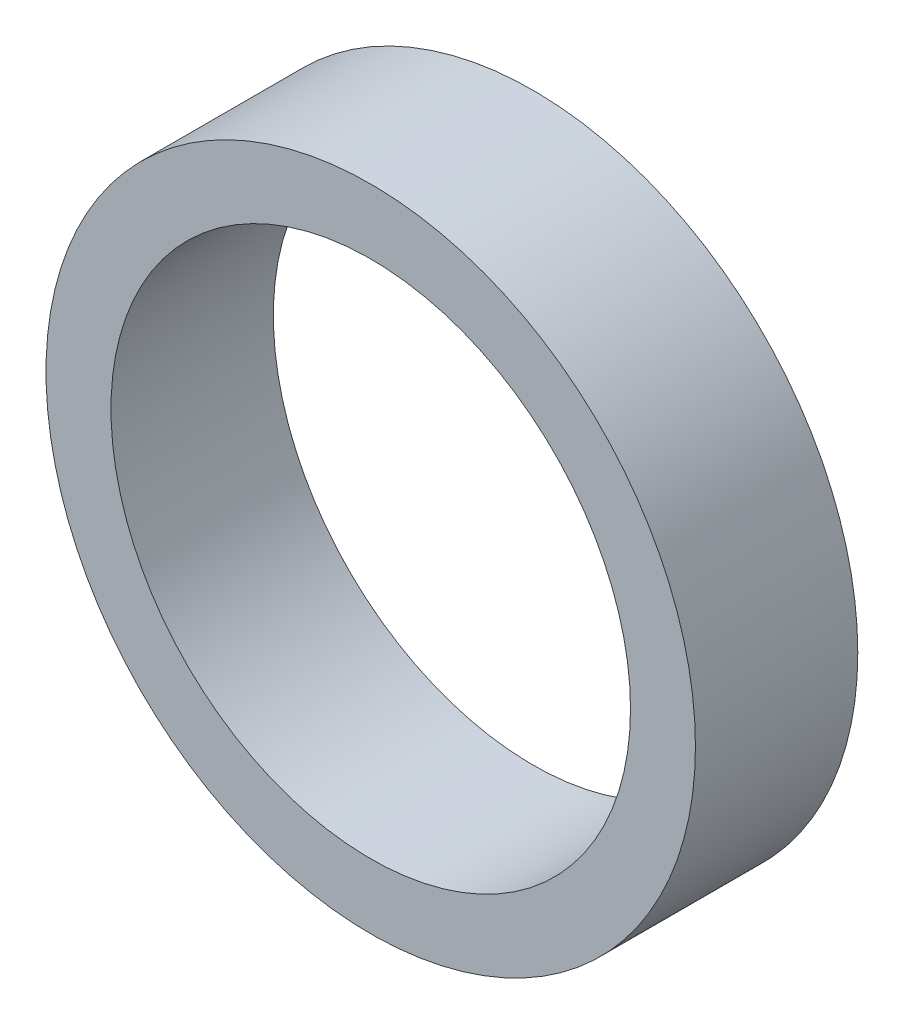
ISO-10303-21;
HEADER;
FILE_DESCRIPTION(('STEP AP214'),'2;1');
FILE_NAME('part.step','',(''),(''),'','','');
FILE_SCHEMA(('AUTOMOTIVE_DESIGN { 1 0 10303 214 1 1 1 1 }'));
ENDSEC;
DATA;
#1=APPLICATION_CONTEXT('core data for automotive mechanical design processes');
#2=APPLICATION_PROTOCOL_DEFINITION('international standard','automotive_design',2000,#1);
#3=PRODUCT_CONTEXT('',#1,'mechanical');
#4=PRODUCT('Part','Part','',(#3));
#5=PRODUCT_RELATED_PRODUCT_CATEGORY('part','',(#4));
#6=PRODUCT_DEFINITION_FORMATION('','',#4);
#7=PRODUCT_DEFINITION_CONTEXT('part definition',#1,'design');
#8=PRODUCT_DEFINITION('design','',#6,#7);
#9=PRODUCT_DEFINITION_SHAPE('','',#8);
#10=(LENGTH_UNIT() NAMED_UNIT(*) SI_UNIT(.MILLI.,.METRE.));
#11=(NAMED_UNIT(*) PLANE_ANGLE_UNIT() SI_UNIT($,.RADIAN.));
#12=(NAMED_UNIT(*) SI_UNIT($,.STERADIAN.) SOLID_ANGLE_UNIT());
#13=UNCERTAINTY_MEASURE_WITH_UNIT(LENGTH_MEASURE(1.E-05),#10,'distance_accuracy_value','');
#14=(GEOMETRIC_REPRESENTATION_CONTEXT(3) GLOBAL_UNCERTAINTY_ASSIGNED_CONTEXT((#13)) GLOBAL_UNIT_ASSIGNED_CONTEXT((#10,
#11,#12)) REPRESENTATION_CONTEXT('',''));
#15=CARTESIAN_POINT('',(0.,0.,0.));
#16=DIRECTION('',(0.,0.,1.));
#17=DIRECTION('',(1.,0.,0.));
#18=AXIS2_PLACEMENT_3D('',#15,#16,#17);
#19=CARTESIAN_POINT('',(0.,0.,1.));
#20=DIRECTION('',(0.,0.,1.));
#21=DIRECTION('',(1.,0.,0.));
#22=AXIS2_PLACEMENT_3D('',#19,#20,#21);
#23=PLANE('',#22);
#24=CARTESIAN_POINT('',(0.,0.,1.));
#25=DIRECTION('',(0.,0.,1.));
#26=DIRECTION('',(1.,0.,0.));
#27=AXIS2_PLACEMENT_3D('',#24,#25,#26);
#28=CIRCLE('',#27,2.);
#29=CARTESIAN_POINT('',(2.,0.,1.));
#30=VERTEX_POINT('',#29);
#31=EDGE_CURVE('E10',#30,#30,#28,.T.);
#32=ORIENTED_EDGE('',*,*,#31,.T.);
#33=EDGE_LOOP('',(#32));
#34=FACE_BOUND('',#33,.T.);
#35=CARTESIAN_POINT('',(0.,0.,1.));
#36=DIRECTION('',(0.,0.,1.));
#37=DIRECTION('',(1.,0.,0.));
#38=AXIS2_PLACEMENT_3D('',#35,#36,#37);
#39=CIRCLE('',#38,1.6);
#40=CARTESIAN_POINT('',(1.6,0.,1.));
#41=VERTEX_POINT('',#40);
#42=EDGE_CURVE('E42',#41,#41,#39,.T.);
#43=ORIENTED_EDGE('',*,*,#42,.F.);
#44=EDGE_LOOP('',(#43));
#45=FACE_BOUND('',#44,.T.);
#46=ADVANCED_FACE('F31',(#34,#45),#23,.T.);
#47=CARTESIAN_POINT('',(0.,0.,0.));
#48=DIRECTION('',(0.,0.,1.));
#49=DIRECTION('',(1.,0.,0.));
#50=AXIS2_PLACEMENT_3D('',#47,#48,#49);
#51=PLANE('',#50);
#52=CARTESIAN_POINT('',(0.,0.,0.));
#53=DIRECTION('',(0.,0.,1.));
#54=DIRECTION('',(1.,0.,0.));
#55=AXIS2_PLACEMENT_3D('',#52,#53,#54);
#56=CIRCLE('',#55,2.);
#57=CARTESIAN_POINT('',(2.,0.,0.));
#58=VERTEX_POINT('',#57);
#59=EDGE_CURVE('E35',#58,#58,#56,.T.);
#60=ORIENTED_EDGE('',*,*,#59,.F.);
#61=EDGE_LOOP('',(#60));
#62=FACE_BOUND('',#61,.T.);
#63=CARTESIAN_POINT('',(0.,0.,0.));
#64=DIRECTION('',(0.,0.,1.));
#65=DIRECTION('',(1.,0.,0.));
#66=AXIS2_PLACEMENT_3D('',#63,#64,#65);
#67=CIRCLE('',#66,1.6);
#68=CARTESIAN_POINT('',(1.6,0.,0.));
#69=VERTEX_POINT('',#68);
#70=EDGE_CURVE('E44',#69,#69,#67,.T.);
#71=ORIENTED_EDGE('',*,*,#70,.T.);
#72=EDGE_LOOP('',(#71));
#73=FACE_BOUND('',#72,.T.);
#74=ADVANCED_FACE('F54',(#62,#73),#51,.F.);
#75=CARTESIAN_POINT('',(0.,0.,1.));
#76=DIRECTION('',(0.,0.,-1.));
#77=DIRECTION('',(-1.,0.,0.));
#78=AXIS2_PLACEMENT_3D('',#75,#76,#77);
#79=CYLINDRICAL_SURFACE('',#78,2.);
#80=ORIENTED_EDGE('',*,*,#31,.F.);
#81=EDGE_LOOP('',(#80));
#82=FACE_BOUND('',#81,.T.);
#83=ORIENTED_EDGE('',*,*,#59,.T.);
#84=EDGE_LOOP('',(#83));
#85=FACE_BOUND('',#84,.T.);
#86=ADVANCED_FACE('F33',(#82,#85),#79,.T.);
#87=CARTESIAN_POINT('',(0.,0.,1.));
#88=DIRECTION('',(0.,0.,-1.));
#89=DIRECTION('',(-1.,0.,0.));
#90=AXIS2_PLACEMENT_3D('',#87,#88,#89);
#91=CYLINDRICAL_SURFACE('',#90,1.6);
#92=ORIENTED_EDGE('',*,*,#42,.T.);
#93=EDGE_LOOP('',(#92));
#94=FACE_BOUND('',#93,.T.);
#95=ORIENTED_EDGE('',*,*,#70,.F.);
#96=EDGE_LOOP('',(#95));
#97=FACE_BOUND('',#96,.T.);
#98=ADVANCED_FACE('F50',(#94,#97),#91,.F.);
#99=CLOSED_SHELL('',(#46,#74,#86,#98));
#100=MANIFOLD_SOLID_BREP('B2',#99);
#101=ADVANCED_BREP_SHAPE_REPRESENTATION('',(#18,#100),#14);
#102=SHAPE_DEFINITION_REPRESENTATION(#9,#101);
ENDSEC;
END-ISO-10303-21;
